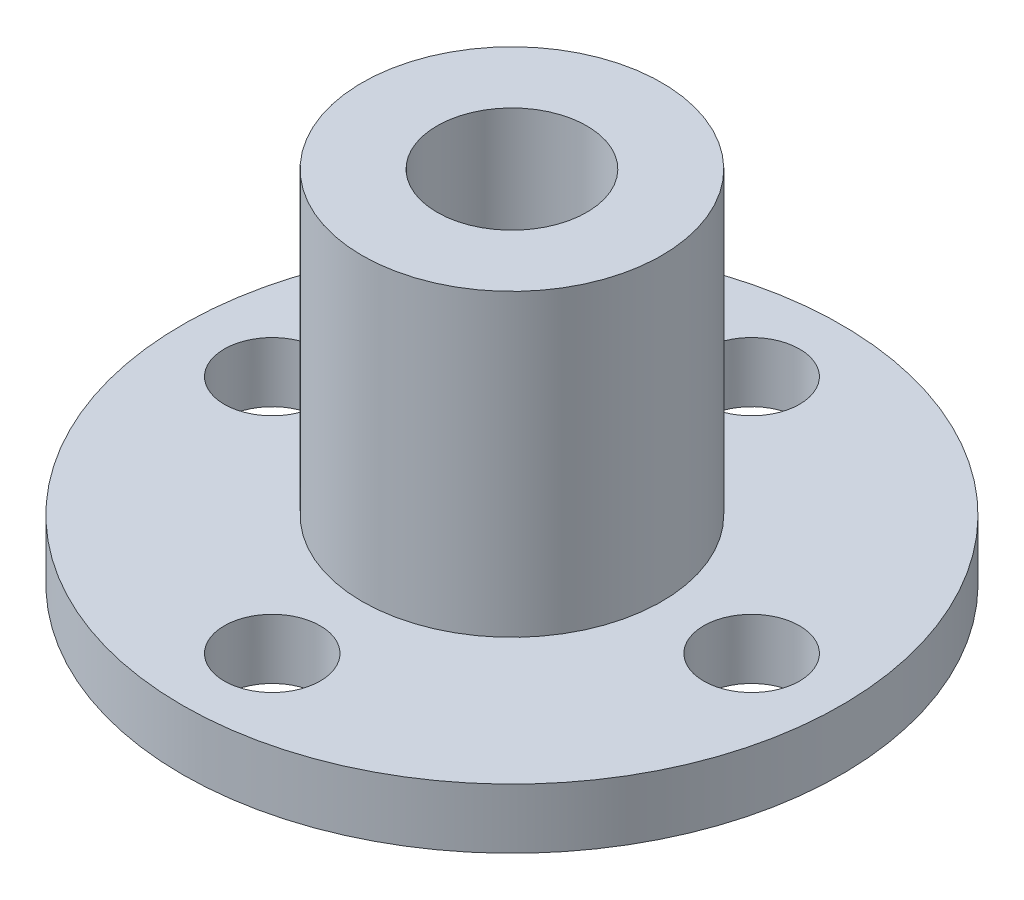
ISO-10303-21;
HEADER;
FILE_DESCRIPTION(('STEP AP214'),'2;1');
FILE_NAME('part.step','',(''),(''),'','','');
FILE_SCHEMA(('AUTOMOTIVE_DESIGN { 1 0 10303 214 1 1 1 1 }'));
ENDSEC;
DATA;
#1=APPLICATION_CONTEXT('core data for automotive mechanical design processes');
#2=APPLICATION_PROTOCOL_DEFINITION('international standard','automotive_design',2000,#1);
#3=PRODUCT_CONTEXT('',#1,'mechanical');
#4=PRODUCT('Part','Part','',(#3));
#5=PRODUCT_RELATED_PRODUCT_CATEGORY('part','',(#4));
#6=PRODUCT_DEFINITION_FORMATION('','',#4);
#7=PRODUCT_DEFINITION_CONTEXT('part definition',#1,'design');
#8=PRODUCT_DEFINITION('design','',#6,#7);
#9=PRODUCT_DEFINITION_SHAPE('','',#8);
#10=(LENGTH_UNIT() NAMED_UNIT(*) SI_UNIT(.MILLI.,.METRE.));
#11=(NAMED_UNIT(*) PLANE_ANGLE_UNIT() SI_UNIT($,.RADIAN.));
#12=(NAMED_UNIT(*) SI_UNIT($,.STERADIAN.) SOLID_ANGLE_UNIT());
#13=UNCERTAINTY_MEASURE_WITH_UNIT(LENGTH_MEASURE(1.E-05),#10,'distance_accuracy_value','');
#14=(GEOMETRIC_REPRESENTATION_CONTEXT(3) GLOBAL_UNCERTAINTY_ASSIGNED_CONTEXT((#13)) GLOBAL_UNIT_ASSIGNED_CONTEXT((#10,
#11,#12)) REPRESENTATION_CONTEXT('',''));
#15=CARTESIAN_POINT('',(0.,0.,0.));
#16=DIRECTION('',(0.,0.,1.));
#17=DIRECTION('',(1.,0.,0.));
#18=AXIS2_PLACEMENT_3D('',#15,#16,#17);
#19=CARTESIAN_POINT('',(0.,2.,0.));
#20=DIRECTION('',(0.,-1.,0.));
#21=DIRECTION('',(0.,0.,-1.));
#22=AXIS2_PLACEMENT_3D('',#19,#20,#21);
#23=CYLINDRICAL_SURFACE('',#22,11.);
#24=CARTESIAN_POINT('',(0.,2.,0.));
#25=DIRECTION('',(0.,1.,0.));
#26=DIRECTION('',(0.,0.,1.));
#27=AXIS2_PLACEMENT_3D('',#24,#25,#26);
#28=CIRCLE('',#27,11.);
#29=CARTESIAN_POINT('',(0.,2.,11.));
#30=VERTEX_POINT('',#29);
#31=EDGE_CURVE('E50',#30,#30,#28,.T.);
#32=ORIENTED_EDGE('',*,*,#31,.F.);
#33=EDGE_LOOP('',(#32));
#34=FACE_BOUND('',#33,.T.);
#35=CARTESIAN_POINT('',(0.,0.,0.));
#36=DIRECTION('',(0.,1.,0.));
#37=DIRECTION('',(0.,0.,1.));
#38=AXIS2_PLACEMENT_3D('',#35,#36,#37);
#39=CIRCLE('',#38,11.);
#40=CARTESIAN_POINT('',(0.,0.,11.));
#41=VERTEX_POINT('',#40);
#42=EDGE_CURVE('E45',#41,#41,#39,.T.);
#43=ORIENTED_EDGE('',*,*,#42,.T.);
#44=EDGE_LOOP('',(#43));
#45=FACE_BOUND('',#44,.T.);
#46=ADVANCED_FACE('F42',(#34,#45),#23,.T.);
#47=CARTESIAN_POINT('',(0.,2.,0.));
#48=DIRECTION('',(0.,1.,0.));
#49=DIRECTION('',(0.,0.,1.));
#50=AXIS2_PLACEMENT_3D('',#47,#48,#49);
#51=PLANE('',#50);
#52=CARTESIAN_POINT('',(0.,2.,8.));
#53=DIRECTION('',(0.,1.,0.));
#54=DIRECTION('',(0.,0.,1.));
#55=AXIS2_PLACEMENT_3D('',#52,#53,#54);
#56=CIRCLE('',#55,1.6);
#57=CARTESIAN_POINT('',(0.,2.,9.6));
#58=VERTEX_POINT('',#57);
#59=EDGE_CURVE('E66',#58,#58,#56,.T.);
#60=ORIENTED_EDGE('',*,*,#59,.F.);
#61=EDGE_LOOP('',(#60));
#62=FACE_BOUND('',#61,.T.);
#63=CARTESIAN_POINT('',(-8.,2.,0.));
#64=DIRECTION('',(0.,1.,0.));
#65=DIRECTION('',(0.,0.,1.));
#66=AXIS2_PLACEMENT_3D('',#63,#64,#65);
#67=CIRCLE('',#66,1.6);
#68=CARTESIAN_POINT('',(-8.,2.,1.6));
#69=VERTEX_POINT('',#68);
#70=EDGE_CURVE('E73',#69,#69,#67,.T.);
#71=ORIENTED_EDGE('',*,*,#70,.F.);
#72=EDGE_LOOP('',(#71));
#73=FACE_BOUND('',#72,.T.);
#74=CARTESIAN_POINT('',(0.,2.,-8.));
#75=DIRECTION('',(0.,1.,0.));
#76=DIRECTION('',(0.,0.,1.));
#77=AXIS2_PLACEMENT_3D('',#74,#75,#76);
#78=CIRCLE('',#77,1.6);
#79=CARTESIAN_POINT('',(0.,2.,-6.4));
#80=VERTEX_POINT('',#79);
#81=EDGE_CURVE('E77',#80,#80,#78,.T.);
#82=ORIENTED_EDGE('',*,*,#81,.F.);
#83=EDGE_LOOP('',(#82));
#84=FACE_BOUND('',#83,.T.);
#85=CARTESIAN_POINT('',(8.,2.,0.));
#86=DIRECTION('',(0.,1.,0.));
#87=DIRECTION('',(0.,0.,1.));
#88=AXIS2_PLACEMENT_3D('',#85,#86,#87);
#89=CIRCLE('',#88,1.6);
#90=CARTESIAN_POINT('',(8.,2.,1.6));
#91=VERTEX_POINT('',#90);
#92=EDGE_CURVE('E81',#91,#91,#89,.T.);
#93=ORIENTED_EDGE('',*,*,#92,.F.);
#94=EDGE_LOOP('',(#93));
#95=FACE_BOUND('',#94,.T.);
#96=CARTESIAN_POINT('',(0.,2.,0.));
#97=DIRECTION('',(0.,1.,0.));
#98=DIRECTION('',(0.,0.,1.));
#99=AXIS2_PLACEMENT_3D('',#96,#97,#98);
#100=CIRCLE('',#99,5.);
#101=CARTESIAN_POINT('',(0.,2.,5.));
#102=VERTEX_POINT('',#101);
#103=EDGE_CURVE('E10',#102,#102,#100,.T.);
#104=ORIENTED_EDGE('',*,*,#103,.F.);
#105=EDGE_LOOP('',(#104));
#106=FACE_BOUND('',#105,.T.);
#107=ORIENTED_EDGE('',*,*,#31,.T.);
#108=EDGE_LOOP('',(#107));
#109=FACE_BOUND('',#108,.T.);
#110=ADVANCED_FACE('F108',(#62,#73,#84,#95,#106,#109),#51,.T.);
#111=CARTESIAN_POINT('',(0.,0.,0.));
#112=DIRECTION('',(0.,1.,0.));
#113=DIRECTION('',(0.,0.,1.));
#114=AXIS2_PLACEMENT_3D('',#111,#112,#113);
#115=PLANE('',#114);
#116=CARTESIAN_POINT('',(0.,0.,8.));
#117=DIRECTION('',(0.,-1.,0.));
#118=DIRECTION('',(0.,0.,-1.));
#119=AXIS2_PLACEMENT_3D('',#116,#117,#118);
#120=CIRCLE('',#119,1.6);
#121=CARTESIAN_POINT('',(0.,0.,6.4));
#122=VERTEX_POINT('',#121);
#123=EDGE_CURVE('E85',#122,#122,#120,.T.);
#124=ORIENTED_EDGE('',*,*,#123,.F.);
#125=EDGE_LOOP('',(#124));
#126=FACE_BOUND('',#125,.T.);
#127=CARTESIAN_POINT('',(-8.,0.,0.));
#128=DIRECTION('',(0.,-1.,0.));
#129=DIRECTION('',(0.,0.,-1.));
#130=AXIS2_PLACEMENT_3D('',#127,#128,#129);
#131=CIRCLE('',#130,1.6);
#132=CARTESIAN_POINT('',(-8.,0.,-1.6));
#133=VERTEX_POINT('',#132);
#134=EDGE_CURVE('E94',#133,#133,#131,.T.);
#135=ORIENTED_EDGE('',*,*,#134,.F.);
#136=EDGE_LOOP('',(#135));
#137=FACE_BOUND('',#136,.T.);
#138=CARTESIAN_POINT('',(0.,0.,-8.));
#139=DIRECTION('',(0.,-1.,0.));
#140=DIRECTION('',(0.,0.,-1.));
#141=AXIS2_PLACEMENT_3D('',#138,#139,#140);
#142=CIRCLE('',#141,1.6);
#143=CARTESIAN_POINT('',(0.,0.,-9.6));
#144=VERTEX_POINT('',#143);
#145=EDGE_CURVE('E90',#144,#144,#142,.T.);
#146=ORIENTED_EDGE('',*,*,#145,.F.);
#147=EDGE_LOOP('',(#146));
#148=FACE_BOUND('',#147,.T.);
#149=CARTESIAN_POINT('',(8.,0.,0.));
#150=DIRECTION('',(0.,-1.,0.));
#151=DIRECTION('',(0.,0.,-1.));
#152=AXIS2_PLACEMENT_3D('',#149,#150,#151);
#153=CIRCLE('',#152,1.6);
#154=CARTESIAN_POINT('',(8.,0.,-1.6));
#155=VERTEX_POINT('',#154);
#156=EDGE_CURVE('E86',#155,#155,#153,.T.);
#157=ORIENTED_EDGE('',*,*,#156,.F.);
#158=EDGE_LOOP('',(#157));
#159=FACE_BOUND('',#158,.T.);
#160=CARTESIAN_POINT('',(0.,0.,0.));
#161=DIRECTION('',(0.,1.,0.));
#162=DIRECTION('',(0.,0.,1.));
#163=AXIS2_PLACEMENT_3D('',#160,#161,#162);
#164=CIRCLE('',#163,2.5);
#165=CARTESIAN_POINT('',(0.,0.,2.5));
#166=VERTEX_POINT('',#165);
#167=EDGE_CURVE('E61',#166,#166,#164,.T.);
#168=ORIENTED_EDGE('',*,*,#167,.T.);
#169=EDGE_LOOP('',(#168));
#170=FACE_BOUND('',#169,.T.);
#171=ORIENTED_EDGE('',*,*,#42,.F.);
#172=EDGE_LOOP('',(#171));
#173=FACE_BOUND('',#172,.T.);
#174=ADVANCED_FACE('F104',(#126,#137,#148,#159,#170,#173),#115,.F.);
#175=CARTESIAN_POINT('',(0.,12.,0.));
#176=DIRECTION('',(0.,-1.,0.));
#177=DIRECTION('',(0.,0.,-1.));
#178=AXIS2_PLACEMENT_3D('',#175,#176,#177);
#179=CYLINDRICAL_SURFACE('',#178,5.);
#180=CARTESIAN_POINT('',(0.,12.,0.));
#181=DIRECTION('',(0.,1.,0.));
#182=DIRECTION('',(0.,0.,1.));
#183=AXIS2_PLACEMENT_3D('',#180,#181,#182);
#184=CIRCLE('',#183,5.);
#185=CARTESIAN_POINT('',(0.,12.,5.));
#186=VERTEX_POINT('',#185);
#187=EDGE_CURVE('E57',#186,#186,#184,.T.);
#188=ORIENTED_EDGE('',*,*,#187,.F.);
#189=EDGE_LOOP('',(#188));
#190=FACE_BOUND('',#189,.T.);
#191=ORIENTED_EDGE('',*,*,#103,.T.);
#192=EDGE_LOOP('',(#191));
#193=FACE_BOUND('',#192,.T.);
#194=ADVANCED_FACE('F107',(#190,#193),#179,.T.);
#195=CARTESIAN_POINT('',(0.,12.,0.));
#196=DIRECTION('',(0.,1.,0.));
#197=DIRECTION('',(0.,0.,1.));
#198=AXIS2_PLACEMENT_3D('',#195,#196,#197);
#199=PLANE('',#198);
#200=CARTESIAN_POINT('',(0.,12.,0.));
#201=DIRECTION('',(0.,1.,0.));
#202=DIRECTION('',(0.,0.,1.));
#203=AXIS2_PLACEMENT_3D('',#200,#201,#202);
#204=CIRCLE('',#203,2.5);
#205=CARTESIAN_POINT('',(0.,12.,2.5));
#206=VERTEX_POINT('',#205);
#207=EDGE_CURVE('E62',#206,#206,#204,.T.);
#208=ORIENTED_EDGE('',*,*,#207,.F.);
#209=EDGE_LOOP('',(#208));
#210=FACE_BOUND('',#209,.T.);
#211=ORIENTED_EDGE('',*,*,#187,.T.);
#212=EDGE_LOOP('',(#211));
#213=FACE_BOUND('',#212,.T.);
#214=ADVANCED_FACE('F138',(#210,#213),#199,.T.);
#215=CARTESIAN_POINT('',(0.,0.,0.));
#216=DIRECTION('',(0.,1.,0.));
#217=DIRECTION('',(0.,0.,1.));
#218=AXIS2_PLACEMENT_3D('',#215,#216,#217);
#219=CYLINDRICAL_SURFACE('',#218,2.5);
#220=ORIENTED_EDGE('',*,*,#167,.F.);
#221=EDGE_LOOP('',(#220));
#222=FACE_BOUND('',#221,.T.);
#223=ORIENTED_EDGE('',*,*,#207,.T.);
#224=EDGE_LOOP('',(#223));
#225=FACE_BOUND('',#224,.T.);
#226=ADVANCED_FACE('F142',(#222,#225),#219,.F.);
#227=CARTESIAN_POINT('',(8.,12.,0.));
#228=DIRECTION('',(0.,-1.,0.));
#229=DIRECTION('',(0.,0.,-1.));
#230=AXIS2_PLACEMENT_3D('',#227,#228,#229);
#231=CYLINDRICAL_SURFACE('',#230,1.6);
#232=ORIENTED_EDGE('',*,*,#92,.T.);
#233=EDGE_LOOP('',(#232));
#234=FACE_BOUND('',#233,.T.);
#235=ORIENTED_EDGE('',*,*,#156,.T.);
#236=EDGE_LOOP('',(#235));
#237=FACE_BOUND('',#236,.T.);
#238=ADVANCED_FACE('F145',(#234,#237),#231,.F.);
#239=CARTESIAN_POINT('',(0.,12.,-8.));
#240=DIRECTION('',(0.,-1.,0.));
#241=DIRECTION('',(0.,0.,-1.));
#242=AXIS2_PLACEMENT_3D('',#239,#240,#241);
#243=CYLINDRICAL_SURFACE('',#242,1.6);
#244=ORIENTED_EDGE('',*,*,#81,.T.);
#245=EDGE_LOOP('',(#244));
#246=FACE_BOUND('',#245,.T.);
#247=ORIENTED_EDGE('',*,*,#145,.T.);
#248=EDGE_LOOP('',(#247));
#249=FACE_BOUND('',#248,.T.);
#250=ADVANCED_FACE('F149',(#246,#249),#243,.F.);
#251=CARTESIAN_POINT('',(-8.,12.,0.));
#252=DIRECTION('',(0.,-1.,0.));
#253=DIRECTION('',(0.,0.,-1.));
#254=AXIS2_PLACEMENT_3D('',#251,#252,#253);
#255=CYLINDRICAL_SURFACE('',#254,1.6);
#256=ORIENTED_EDGE('',*,*,#70,.T.);
#257=EDGE_LOOP('',(#256));
#258=FACE_BOUND('',#257,.T.);
#259=ORIENTED_EDGE('',*,*,#134,.T.);
#260=EDGE_LOOP('',(#259));
#261=FACE_BOUND('',#260,.T.);
#262=ADVANCED_FACE('F153',(#258,#261),#255,.F.);
#263=CARTESIAN_POINT('',(0.,12.,8.));
#264=DIRECTION('',(0.,-1.,0.));
#265=DIRECTION('',(0.,0.,-1.));
#266=AXIS2_PLACEMENT_3D('',#263,#264,#265);
#267=CYLINDRICAL_SURFACE('',#266,1.6);
#268=ORIENTED_EDGE('',*,*,#59,.T.);
#269=EDGE_LOOP('',(#268));
#270=FACE_BOUND('',#269,.T.);
#271=ORIENTED_EDGE('',*,*,#123,.T.);
#272=EDGE_LOOP('',(#271));
#273=FACE_BOUND('',#272,.T.);
#274=ADVANCED_FACE('F102',(#270,#273),#267,.F.);
#275=CLOSED_SHELL('',(#46,#110,#174,#194,#214,#226,#238,#250,#262,#274));
#276=MANIFOLD_SOLID_BREP('B2',#275);
#277=ADVANCED_BREP_SHAPE_REPRESENTATION('',(#18,#276),#14);
#278=SHAPE_DEFINITION_REPRESENTATION(#9,#277);
ENDSEC;
END-ISO-10303-21;
